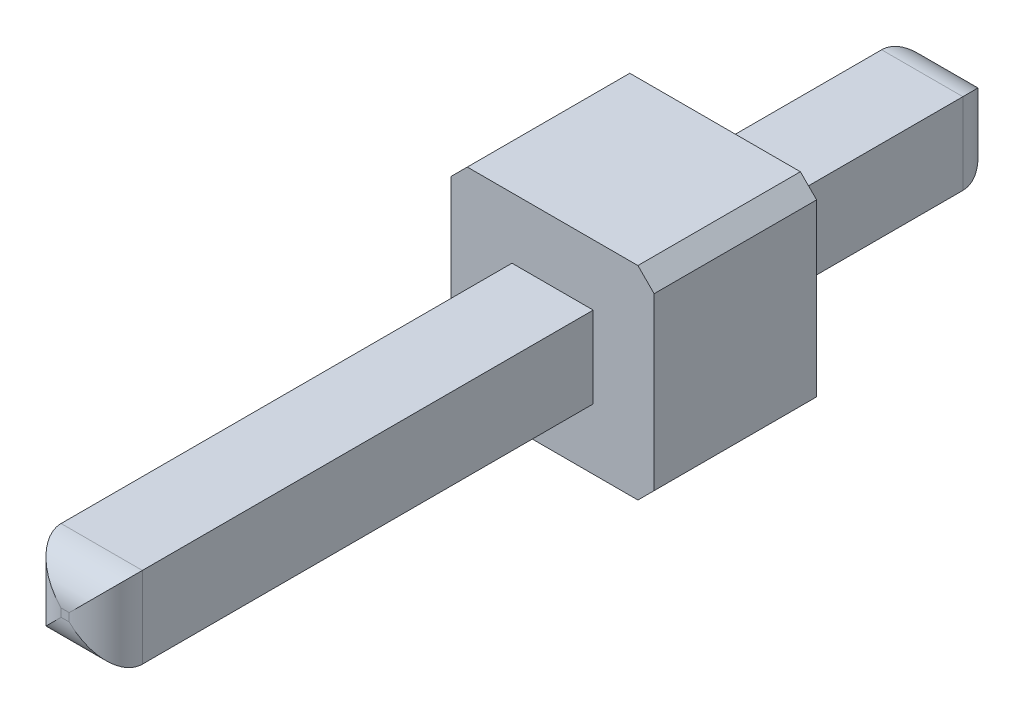
ISO-10303-21;
HEADER;
FILE_DESCRIPTION(('STEP AP214'),'2;1');
FILE_NAME('part.step','',(''),(''),'','','');
FILE_SCHEMA(('AUTOMOTIVE_DESIGN { 1 0 10303 214 1 1 1 1 }'));
ENDSEC;
DATA;
#1=APPLICATION_CONTEXT('core data for automotive mechanical design processes');
#2=APPLICATION_PROTOCOL_DEFINITION('international standard','automotive_design',2000,#1);
#3=PRODUCT_CONTEXT('',#1,'mechanical');
#4=PRODUCT('Part','Part','',(#3));
#5=PRODUCT_RELATED_PRODUCT_CATEGORY('part','',(#4));
#6=PRODUCT_DEFINITION_FORMATION('','',#4);
#7=PRODUCT_DEFINITION_CONTEXT('part definition',#1,'design');
#8=PRODUCT_DEFINITION('design','',#6,#7);
#9=PRODUCT_DEFINITION_SHAPE('','',#8);
#10=(LENGTH_UNIT() NAMED_UNIT(*) SI_UNIT(.MILLI.,.METRE.));
#11=(NAMED_UNIT(*) PLANE_ANGLE_UNIT() SI_UNIT($,.RADIAN.));
#12=(NAMED_UNIT(*) SI_UNIT($,.STERADIAN.) SOLID_ANGLE_UNIT());
#13=UNCERTAINTY_MEASURE_WITH_UNIT(LENGTH_MEASURE(1.E-05),#10,'distance_accuracy_value','');
#14=(GEOMETRIC_REPRESENTATION_CONTEXT(3) GLOBAL_UNCERTAINTY_ASSIGNED_CONTEXT((#13)) GLOBAL_UNIT_ASSIGNED_CONTEXT((#10,
#11,#12)) REPRESENTATION_CONTEXT('',''));
#15=CARTESIAN_POINT('',(0.,0.,0.));
#16=DIRECTION('',(0.,0.,1.));
#17=DIRECTION('',(1.,0.,0.));
#18=AXIS2_PLACEMENT_3D('',#15,#16,#17);
#19=CARTESIAN_POINT('',(-0.5,-0.5,0.));
#20=DIRECTION('',(0.,-1.,0.));
#21=DIRECTION('',(0.,0.,-1.));
#22=AXIS2_PLACEMENT_3D('',#19,#20,#21);
#23=PLANE('',#22);
#24=DIRECTION('',(-1.,0.,0.));
#25=VECTOR('',#24,1.);
#26=CARTESIAN_POINT('',(-0.25,-0.5,0.45));
#27=LINE('',#26,#25);
#28=CARTESIAN_POINT('',(0.5,-0.5,0.45));
#29=VERTEX_POINT('',#28);
#30=CARTESIAN_POINT('',(-0.5,-0.5,0.45));
#31=VERTEX_POINT('',#30);
#32=EDGE_CURVE('P0_E178',#29,#31,#27,.T.);
#33=ORIENTED_EDGE('',*,*,#32,.F.);
#34=DIRECTION('',(0.,0.,1.));
#35=VECTOR('',#34,1.);
#36=CARTESIAN_POINT('',(0.5,-0.5,0.));
#37=LINE('',#36,#35);
#38=CARTESIAN_POINT('',(0.5,-0.5,10.55));
#39=VERTEX_POINT('',#38);
#40=EDGE_CURVE('P0_E153',#29,#39,#37,.T.);
#41=ORIENTED_EDGE('',*,*,#40,.T.);
#42=DIRECTION('',(1.,0.,0.));
#43=VECTOR('',#42,1.);
#44=CARTESIAN_POINT('',(-0.25,-0.5,10.55));
#45=LINE('',#44,#43);
#46=CARTESIAN_POINT('',(-0.5,-0.5,10.55));
#47=VERTEX_POINT('',#46);
#48=EDGE_CURVE('P0_E213',#47,#39,#45,.T.);
#49=ORIENTED_EDGE('',*,*,#48,.F.);
#50=DIRECTION('',(0.,0.,1.));
#51=VECTOR('',#50,1.);
#52=CARTESIAN_POINT('',(-0.5,-0.5,0.));
#53=LINE('',#52,#51);
#54=EDGE_CURVE('P0_E11',#31,#47,#53,.T.);
#55=ORIENTED_EDGE('',*,*,#54,.F.);
#56=EDGE_LOOP('',(#33,#41,#49,#55));
#57=FACE_BOUND('',#56,.T.);
#58=ADVANCED_FACE('P0_F16',(#57),#23,.T.);
#59=CARTESIAN_POINT('',(0.,0.,11.));
#60=DIRECTION('',(0.,0.,1.));
#61=DIRECTION('',(1.,0.,0.));
#62=AXIS2_PLACEMENT_3D('',#59,#60,#61);
#63=PLANE('',#62);
#64=DIRECTION('',(1.,0.,0.));
#65=VECTOR('',#64,1.);
#66=CARTESIAN_POINT('',(0.25,0.05,11.));
#67=LINE('',#66,#65);
#68=CARTESIAN_POINT('',(-0.05,0.05,11.));
#69=VERTEX_POINT('',#68);
#70=CARTESIAN_POINT('',(0.05,0.05,11.));
#71=VERTEX_POINT('',#70);
#72=EDGE_CURVE('P0_E189',#69,#71,#67,.T.);
#73=ORIENTED_EDGE('',*,*,#72,.F.);
#74=DIRECTION('',(0.,1.,0.));
#75=VECTOR('',#74,1.);
#76=CARTESIAN_POINT('',(-0.05,0.25,11.));
#77=LINE('',#76,#75);
#78=CARTESIAN_POINT('',(-0.05,-0.05,11.));
#79=VERTEX_POINT('',#78);
#80=EDGE_CURVE('P0_E25',#79,#69,#77,.T.);
#81=ORIENTED_EDGE('',*,*,#80,.F.);
#82=DIRECTION('',(-1.,0.,0.));
#83=VECTOR('',#82,1.);
#84=CARTESIAN_POINT('',(-0.25,-0.05,11.));
#85=LINE('',#84,#83);
#86=CARTESIAN_POINT('',(0.05,-0.05,11.));
#87=VERTEX_POINT('',#86);
#88=EDGE_CURVE('P0_E73',#87,#79,#85,.T.);
#89=ORIENTED_EDGE('',*,*,#88,.F.);
#90=DIRECTION('',(0.,-1.,0.));
#91=VECTOR('',#90,1.);
#92=CARTESIAN_POINT('',(0.05,-0.25,11.));
#93=LINE('',#92,#91);
#94=EDGE_CURVE('P0_E70',#71,#87,#93,.T.);
#95=ORIENTED_EDGE('',*,*,#94,.F.);
#96=EDGE_LOOP('',(#73,#81,#89,#95));
#97=FACE_BOUND('',#96,.T.);
#98=ADVANCED_FACE('P0_F228',(#97),#63,.T.);
#99=CARTESIAN_POINT('',(-0.5,0.5,0.));
#100=DIRECTION('',(-1.,0.,0.));
#101=DIRECTION('',(0.,0.,1.));
#102=AXIS2_PLACEMENT_3D('',#99,#100,#101);
#103=PLANE('',#102);
#104=DIRECTION('',(0.,1.,0.));
#105=VECTOR('',#104,1.);
#106=CARTESIAN_POINT('',(-0.5,0.25,0.45));
#107=LINE('',#106,#105);
#108=CARTESIAN_POINT('',(-0.5,0.5,0.45));
#109=VERTEX_POINT('',#108);
#110=EDGE_CURVE('P0_E166',#31,#109,#107,.T.);
#111=ORIENTED_EDGE('',*,*,#110,.F.);
#112=ORIENTED_EDGE('',*,*,#54,.T.);
#113=DIRECTION('',(0.,-1.,0.));
#114=VECTOR('',#113,1.);
#115=CARTESIAN_POINT('',(-0.5,0.25,10.55));
#116=LINE('',#115,#114);
#117=CARTESIAN_POINT('',(-0.5,0.5,10.55));
#118=VERTEX_POINT('',#117);
#119=EDGE_CURVE('P0_E150',#118,#47,#116,.T.);
#120=ORIENTED_EDGE('',*,*,#119,.F.);
#121=DIRECTION('',(0.,0.,1.));
#122=VECTOR('',#121,1.);
#123=CARTESIAN_POINT('',(-0.5,0.5,0.));
#124=LINE('',#123,#122);
#125=EDGE_CURVE('P0_E146',#109,#118,#124,.T.);
#126=ORIENTED_EDGE('',*,*,#125,.F.);
#127=EDGE_LOOP('',(#111,#112,#120,#126));
#128=FACE_BOUND('',#127,.T.);
#129=ADVANCED_FACE('P0_F231',(#128),#103,.T.);
#130=CARTESIAN_POINT('',(-0.05,0.25,10.55));
#131=DIRECTION('',(0.,-1.,0.));
#132=DIRECTION('',(-0.707106781186548,0.,0.707106781186547));
#133=AXIS2_PLACEMENT_3D('',#130,#131,#132);
#134=CYLINDRICAL_SURFACE('',#133,0.45);
#135=ORIENTED_EDGE('',*,*,#119,.T.);
#136=CARTESIAN_POINT('',(-0.05,-0.05,10.55));
#137=DIRECTION('',(0.707106781186548,-0.707106781186548,0.));
#138=DIRECTION('',(-0.707106781186548,-0.707106781186548,0.));
#139=AXIS2_PLACEMENT_3D('',#136,#137,#138);
#140=ELLIPSE('',#139,0.636396103067893,0.45);
#141=EDGE_CURVE('P0_E207',#79,#47,#140,.T.);
#142=ORIENTED_EDGE('',*,*,#141,.F.);
#143=ORIENTED_EDGE('',*,*,#80,.T.);
#144=CARTESIAN_POINT('',(-0.05,0.05,10.55));
#145=DIRECTION('',(-0.707106781186548,-0.707106781186548,0.));
#146=DIRECTION('',(-0.707106781186548,0.707106781186548,0.));
#147=AXIS2_PLACEMENT_3D('',#144,#145,#146);
#148=ELLIPSE('',#147,0.636396103067893,0.45);
#149=EDGE_CURVE('P0_E196',#69,#118,#148,.T.);
#150=ORIENTED_EDGE('',*,*,#149,.T.);
#151=EDGE_LOOP('',(#135,#142,#143,#150));
#152=FACE_BOUND('',#151,.T.);
#153=ADVANCED_FACE('P0_F217',(#152),#134,.T.);
#154=CARTESIAN_POINT('',(-0.25,-0.05,10.55));
#155=DIRECTION('',(1.,0.,0.));
#156=DIRECTION('',(0.,-0.707106781186548,0.707106781186547));
#157=AXIS2_PLACEMENT_3D('',#154,#155,#156);
#158=CYLINDRICAL_SURFACE('',#157,0.45);
#159=ORIENTED_EDGE('',*,*,#88,.T.);
#160=ORIENTED_EDGE('',*,*,#141,.T.);
#161=ORIENTED_EDGE('',*,*,#48,.T.);
#162=CARTESIAN_POINT('',(0.05,-0.05,10.55));
#163=DIRECTION('',(0.707106781186548,0.707106781186548,0.));
#164=DIRECTION('',(0.707106781186548,-0.707106781186548,0.));
#165=AXIS2_PLACEMENT_3D('',#162,#163,#164);
#166=ELLIPSE('',#165,0.636396103067893,0.45);
#167=EDGE_CURVE('P0_E201',#87,#39,#166,.T.);
#168=ORIENTED_EDGE('',*,*,#167,.F.);
#169=EDGE_LOOP('',(#159,#160,#161,#168));
#170=FACE_BOUND('',#169,.T.);
#171=ADVANCED_FACE('P0_F224',(#170),#158,.T.);
#172=CARTESIAN_POINT('',(0.05,-0.25,10.55));
#173=DIRECTION('',(0.,1.,0.));
#174=DIRECTION('',(0.707106781186548,0.,0.707106781186547));
#175=AXIS2_PLACEMENT_3D('',#172,#173,#174);
#176=CYLINDRICAL_SURFACE('',#175,0.45);
#177=ORIENTED_EDGE('',*,*,#94,.T.);
#178=ORIENTED_EDGE('',*,*,#167,.T.);
#179=DIRECTION('',(0.,1.,0.));
#180=VECTOR('',#179,1.);
#181=CARTESIAN_POINT('',(0.5,-0.25,10.55));
#182=LINE('',#181,#180);
#183=CARTESIAN_POINT('',(0.5,0.5,10.55));
#184=VERTEX_POINT('',#183);
#185=EDGE_CURVE('P0_E156',#39,#184,#182,.T.);
#186=ORIENTED_EDGE('',*,*,#185,.T.);
#187=CARTESIAN_POINT('',(0.05,0.05,10.55));
#188=DIRECTION('',(-0.707106781186548,0.707106781186548,0.));
#189=DIRECTION('',(0.707106781186548,0.707106781186548,0.));
#190=AXIS2_PLACEMENT_3D('',#187,#188,#189);
#191=ELLIPSE('',#190,0.636396103067893,0.45);
#192=EDGE_CURVE('P0_E192',#71,#184,#191,.T.);
#193=ORIENTED_EDGE('',*,*,#192,.F.);
#194=EDGE_LOOP('',(#177,#178,#186,#193));
#195=FACE_BOUND('',#194,.T.);
#196=ADVANCED_FACE('P0_F223',(#195),#176,.T.);
#197=CARTESIAN_POINT('',(0.25,0.05,10.55));
#198=DIRECTION('',(-1.,0.,0.));
#199=DIRECTION('',(0.,0.707106781186548,0.707106781186547));
#200=AXIS2_PLACEMENT_3D('',#197,#198,#199);
#201=CYLINDRICAL_SURFACE('',#200,0.45);
#202=ORIENTED_EDGE('',*,*,#72,.T.);
#203=ORIENTED_EDGE('',*,*,#192,.T.);
#204=DIRECTION('',(-1.,0.,0.));
#205=VECTOR('',#204,1.);
#206=CARTESIAN_POINT('',(0.25,0.5,10.55));
#207=LINE('',#206,#205);
#208=EDGE_CURVE('P0_E155',#184,#118,#207,.T.);
#209=ORIENTED_EDGE('',*,*,#208,.T.);
#210=ORIENTED_EDGE('',*,*,#149,.F.);
#211=EDGE_LOOP('',(#202,#203,#209,#210));
#212=FACE_BOUND('',#211,.T.);
#213=ADVANCED_FACE('P0_F229',(#212),#201,.T.);
#214=CARTESIAN_POINT('',(0.,0.,0.));
#215=DIRECTION('',(0.,0.,1.));
#216=DIRECTION('',(1.,0.,0.));
#217=AXIS2_PLACEMENT_3D('',#214,#215,#216);
#218=PLANE('',#217);
#219=DIRECTION('',(-1.,0.,0.));
#220=VECTOR('',#219,1.);
#221=CARTESIAN_POINT('',(0.25,0.05,0.));
#222=LINE('',#221,#220);
#223=CARTESIAN_POINT('',(0.05,0.05,0.));
#224=VERTEX_POINT('',#223);
#225=CARTESIAN_POINT('',(-0.05,0.05,0.));
#226=VERTEX_POINT('',#225);
#227=EDGE_CURVE('P0_E127',#224,#226,#222,.T.);
#228=ORIENTED_EDGE('',*,*,#227,.F.);
#229=DIRECTION('',(0.,1.,0.));
#230=VECTOR('',#229,1.);
#231=CARTESIAN_POINT('',(0.05,-0.25,0.));
#232=LINE('',#231,#230);
#233=CARTESIAN_POINT('',(0.05,-0.05,0.));
#234=VERTEX_POINT('',#233);
#235=EDGE_CURVE('P0_E109',#234,#224,#232,.T.);
#236=ORIENTED_EDGE('',*,*,#235,.F.);
#237=DIRECTION('',(1.,0.,0.));
#238=VECTOR('',#237,1.);
#239=CARTESIAN_POINT('',(-0.25,-0.05,0.));
#240=LINE('',#239,#238);
#241=CARTESIAN_POINT('',(-0.05,-0.05,0.));
#242=VERTEX_POINT('',#241);
#243=EDGE_CURVE('P0_E174',#242,#234,#240,.T.);
#244=ORIENTED_EDGE('',*,*,#243,.F.);
#245=DIRECTION('',(0.,-1.,0.));
#246=VECTOR('',#245,1.);
#247=CARTESIAN_POINT('',(-0.05,0.25,0.));
#248=LINE('',#247,#246);
#249=EDGE_CURVE('P0_E132',#226,#242,#248,.T.);
#250=ORIENTED_EDGE('',*,*,#249,.F.);
#251=EDGE_LOOP('',(#228,#236,#244,#250));
#252=FACE_BOUND('',#251,.T.);
#253=ADVANCED_FACE('P0_F134',(#252),#218,.F.);
#254=CARTESIAN_POINT('',(0.5,0.5,0.));
#255=DIRECTION('',(0.,1.,0.));
#256=DIRECTION('',(1.,0.,0.));
#257=AXIS2_PLACEMENT_3D('',#254,#255,#256);
#258=PLANE('',#257);
#259=DIRECTION('',(1.,0.,0.));
#260=VECTOR('',#259,1.);
#261=CARTESIAN_POINT('',(0.25,0.5,0.45));
#262=LINE('',#261,#260);
#263=CARTESIAN_POINT('',(0.5,0.5,0.45));
#264=VERTEX_POINT('',#263);
#265=EDGE_CURVE('P0_E131',#109,#264,#262,.T.);
#266=ORIENTED_EDGE('',*,*,#265,.F.);
#267=ORIENTED_EDGE('',*,*,#125,.T.);
#268=ORIENTED_EDGE('',*,*,#208,.F.);
#269=DIRECTION('',(0.,0.,1.));
#270=VECTOR('',#269,1.);
#271=CARTESIAN_POINT('',(0.5,0.5,0.));
#272=LINE('',#271,#270);
#273=EDGE_CURVE('P0_E125',#264,#184,#272,.T.);
#274=ORIENTED_EDGE('',*,*,#273,.F.);
#275=EDGE_LOOP('',(#266,#267,#268,#274));
#276=FACE_BOUND('',#275,.T.);
#277=ADVANCED_FACE('P0_F250',(#276),#258,.T.);
#278=CARTESIAN_POINT('',(0.5,-0.5,0.));
#279=DIRECTION('',(1.,0.,0.));
#280=DIRECTION('',(0.,1.,0.));
#281=AXIS2_PLACEMENT_3D('',#278,#279,#280);
#282=PLANE('',#281);
#283=DIRECTION('',(0.,-1.,0.));
#284=VECTOR('',#283,1.);
#285=CARTESIAN_POINT('',(0.5,-0.25,0.45));
#286=LINE('',#285,#284);
#287=EDGE_CURVE('P0_E123',#264,#29,#286,.T.);
#288=ORIENTED_EDGE('',*,*,#287,.F.);
#289=ORIENTED_EDGE('',*,*,#273,.T.);
#290=ORIENTED_EDGE('',*,*,#185,.F.);
#291=ORIENTED_EDGE('',*,*,#40,.F.);
#292=EDGE_LOOP('',(#288,#289,#290,#291));
#293=FACE_BOUND('',#292,.T.);
#294=ADVANCED_FACE('P0_F249',(#293),#282,.T.);
#295=CARTESIAN_POINT('',(0.05,-0.25,0.45));
#296=DIRECTION('',(0.,-1.,0.));
#297=DIRECTION('',(0.707106781186548,0.,-0.707106781186548));
#298=AXIS2_PLACEMENT_3D('',#295,#296,#297);
#299=CYLINDRICAL_SURFACE('',#298,0.45);
#300=ORIENTED_EDGE('',*,*,#287,.T.);
#301=CARTESIAN_POINT('',(0.05,-0.05,0.45));
#302=DIRECTION('',(-0.707106781186548,-0.707106781186548,0.));
#303=DIRECTION('',(0.707106781186548,-0.707106781186548,0.));
#304=AXIS2_PLACEMENT_3D('',#301,#302,#303);
#305=ELLIPSE('',#304,0.636396103067893,0.45);
#306=EDGE_CURVE('P0_E117',#234,#29,#305,.T.);
#307=ORIENTED_EDGE('',*,*,#306,.F.);
#308=ORIENTED_EDGE('',*,*,#235,.T.);
#309=CARTESIAN_POINT('',(0.05,0.05,0.45));
#310=DIRECTION('',(-0.707106781186548,0.707106781186548,0.));
#311=DIRECTION('',(-0.707106781186548,-0.707106781186548,0.));
#312=AXIS2_PLACEMENT_3D('',#309,#310,#311);
#313=ELLIPSE('',#312,0.636396103067893,0.45);
#314=EDGE_CURVE('P0_E111',#264,#224,#313,.T.);
#315=ORIENTED_EDGE('',*,*,#314,.F.);
#316=EDGE_LOOP('',(#300,#307,#308,#315));
#317=FACE_BOUND('',#316,.T.);
#318=ADVANCED_FACE('P0_F114',(#317),#299,.T.);
#319=CARTESIAN_POINT('',(-0.25,-0.05,0.45));
#320=DIRECTION('',(-1.,0.,0.));
#321=DIRECTION('',(0.,-0.707106781186548,-0.707106781186548));
#322=AXIS2_PLACEMENT_3D('',#319,#320,#321);
#323=CYLINDRICAL_SURFACE('',#322,0.45);
#324=ORIENTED_EDGE('',*,*,#243,.T.);
#325=ORIENTED_EDGE('',*,*,#306,.T.);
#326=ORIENTED_EDGE('',*,*,#32,.T.);
#327=CARTESIAN_POINT('',(-0.05,-0.05,0.45));
#328=DIRECTION('',(-0.707106781186548,0.707106781186548,0.));
#329=DIRECTION('',(-0.707106781186548,-0.707106781186548,0.));
#330=AXIS2_PLACEMENT_3D('',#327,#328,#329);
#331=ELLIPSE('',#330,0.636396103067893,0.45);
#332=EDGE_CURVE('P0_E165',#242,#31,#331,.T.);
#333=ORIENTED_EDGE('',*,*,#332,.F.);
#334=EDGE_LOOP('',(#324,#325,#326,#333));
#335=FACE_BOUND('',#334,.T.);
#336=ADVANCED_FACE('P0_F260',(#335),#323,.T.);
#337=CARTESIAN_POINT('',(-0.05,0.25,0.45));
#338=DIRECTION('',(0.,1.,0.));
#339=DIRECTION('',(-0.707106781186548,0.,-0.707106781186548));
#340=AXIS2_PLACEMENT_3D('',#337,#338,#339);
#341=CYLINDRICAL_SURFACE('',#340,0.45);
#342=ORIENTED_EDGE('',*,*,#249,.T.);
#343=ORIENTED_EDGE('',*,*,#332,.T.);
#344=ORIENTED_EDGE('',*,*,#110,.T.);
#345=CARTESIAN_POINT('',(-0.05,0.05,0.45));
#346=DIRECTION('',(0.707106781186548,0.707106781186548,0.));
#347=DIRECTION('',(-0.707106781186548,0.707106781186548,0.));
#348=AXIS2_PLACEMENT_3D('',#345,#346,#347);
#349=ELLIPSE('',#348,0.636396103067893,0.45);
#350=EDGE_CURVE('P0_E137',#226,#109,#349,.T.);
#351=ORIENTED_EDGE('',*,*,#350,.F.);
#352=EDGE_LOOP('',(#342,#343,#344,#351));
#353=FACE_BOUND('',#352,.T.);
#354=ADVANCED_FACE('P0_F257',(#353),#341,.T.);
#355=CARTESIAN_POINT('',(0.25,0.05,0.45));
#356=DIRECTION('',(1.,0.,0.));
#357=DIRECTION('',(0.,0.707106781186548,-0.707106781186548));
#358=AXIS2_PLACEMENT_3D('',#355,#356,#357);
#359=CYLINDRICAL_SURFACE('',#358,0.45);
#360=ORIENTED_EDGE('',*,*,#227,.T.);
#361=ORIENTED_EDGE('',*,*,#350,.T.);
#362=ORIENTED_EDGE('',*,*,#265,.T.);
#363=ORIENTED_EDGE('',*,*,#314,.T.);
#364=EDGE_LOOP('',(#360,#361,#362,#363));
#365=FACE_BOUND('',#364,.T.);
#366=ADVANCED_FACE('P0_F126',(#365),#359,.T.);
#367=CLOSED_SHELL('',(#58,#98,#129,#153,#171,#196,#213,#253,#277,#294,#318,#336,#354,#366));
#368=MANIFOLD_SOLID_BREP('P0_B1',#367);
#369=CARTESIAN_POINT('',(0.,0.,3.));
#370=DIRECTION('',(0.,0.,-1.));
#371=DIRECTION('',(0.,-1.,0.));
#372=AXIS2_PLACEMENT_3D('',#369,#370,#371);
#373=PLANE('',#372);
#374=DIRECTION('',(0.,1.,0.));
#375=VECTOR('',#374,1.);
#376=CARTESIAN_POINT('',(-1.25,-1.25,3.));
#377=LINE('',#376,#375);
#378=CARTESIAN_POINT('',(-1.25,-1.04999997653067,3.));
#379=VERTEX_POINT('',#378);
#380=CARTESIAN_POINT('',(-1.25,1.04999997653067,3.));
#381=VERTEX_POINT('',#380);
#382=EDGE_CURVE('P1_E11',#379,#381,#377,.T.);
#383=ORIENTED_EDGE('',*,*,#382,.T.);
#384=DIRECTION('',(0.707106830577382,0.70710673179571,0.));
#385=VECTOR('',#384,1.);
#386=CARTESIAN_POINT('',(-1.25,1.04999997653067,3.));
#387=LINE('',#386,#385);
#388=CARTESIAN_POINT('',(-1.04999997653067,1.24999997206032,3.));
#389=VERTEX_POINT('',#388);
#390=EDGE_CURVE('P1_E175',#381,#389,#387,.T.);
#391=ORIENTED_EDGE('',*,*,#390,.T.);
#392=DIRECTION('',(1.,0.,0.));
#393=VECTOR('',#392,1.);
#394=CARTESIAN_POINT('',(-1.25,1.25,3.));
#395=LINE('',#394,#393);
#396=CARTESIAN_POINT('',(1.04999997653067,1.24999997206032,3.));
#397=VERTEX_POINT('',#396);
#398=EDGE_CURVE('P1_E83',#389,#397,#395,.T.);
#399=ORIENTED_EDGE('',*,*,#398,.T.);
#400=DIRECTION('',(0.707106830577382,-0.70710673179571,0.));
#401=VECTOR('',#400,1.);
#402=CARTESIAN_POINT('',(1.25,1.04999997653067,3.));
#403=LINE('',#402,#401);
#404=CARTESIAN_POINT('',(1.25,1.04999997653067,3.));
#405=VERTEX_POINT('',#404);
#406=EDGE_CURVE('P1_E151',#397,#405,#403,.T.);
#407=ORIENTED_EDGE('',*,*,#406,.T.);
#408=DIRECTION('',(0.,-1.,0.));
#409=VECTOR('',#408,1.);
#410=CARTESIAN_POINT('',(1.25,1.25,3.));
#411=LINE('',#410,#409);
#412=CARTESIAN_POINT('',(1.25,-1.04999997653067,3.));
#413=VERTEX_POINT('',#412);
#414=EDGE_CURVE('P1_E149',#405,#413,#411,.T.);
#415=ORIENTED_EDGE('',*,*,#414,.T.);
#416=DIRECTION('',(-0.707106830577382,-0.70710673179571,0.));
#417=VECTOR('',#416,1.);
#418=CARTESIAN_POINT('',(1.25,-1.04999997653067,3.));
#419=LINE('',#418,#417);
#420=CARTESIAN_POINT('',(1.04999997653067,-1.24999997206032,3.));
#421=VERTEX_POINT('',#420);
#422=EDGE_CURVE('P1_E122',#413,#421,#419,.T.);
#423=ORIENTED_EDGE('',*,*,#422,.T.);
#424=DIRECTION('',(-1.,0.,0.));
#425=VECTOR('',#424,1.);
#426=CARTESIAN_POINT('',(1.25,-1.25,3.));
#427=LINE('',#426,#425);
#428=CARTESIAN_POINT('',(-1.04999997653067,-1.24999997206032,3.));
#429=VERTEX_POINT('',#428);
#430=EDGE_CURVE('P1_E104',#421,#429,#427,.T.);
#431=ORIENTED_EDGE('',*,*,#430,.T.);
#432=DIRECTION('',(-0.707106830577382,0.70710673179571,0.));
#433=VECTOR('',#432,1.);
#434=CARTESIAN_POINT('',(-1.25,-1.04999997653067,3.));
#435=LINE('',#434,#433);
#436=EDGE_CURVE('P1_E144',#429,#379,#435,.T.);
#437=ORIENTED_EDGE('',*,*,#436,.T.);
#438=EDGE_LOOP('',(#383,#391,#399,#407,#415,#423,#431,#437));
#439=FACE_BOUND('',#438,.T.);
#440=ADVANCED_FACE('P1_F16',(#439),#373,.T.);
#441=CARTESIAN_POINT('',(0.,0.,5.));
#442=DIRECTION('',(0.,0.,1.));
#443=DIRECTION('',(1.,0.,0.));
#444=AXIS2_PLACEMENT_3D('',#441,#442,#443);
#445=PLANE('',#444);
#446=DIRECTION('',(0.,1.,0.));
#447=VECTOR('',#446,1.);
#448=CARTESIAN_POINT('',(-1.25,-1.25,5.));
#449=LINE('',#448,#447);
#450=CARTESIAN_POINT('',(-1.25,-1.04999997653067,5.));
#451=VERTEX_POINT('',#450);
#452=CARTESIAN_POINT('',(-1.25,1.04999997653067,5.));
#453=VERTEX_POINT('',#452);
#454=EDGE_CURVE('P1_E27',#451,#453,#449,.T.);
#455=ORIENTED_EDGE('',*,*,#454,.F.);
#456=DIRECTION('',(0.707106830577382,-0.70710673179571,0.));
#457=VECTOR('',#456,1.);
#458=CARTESIAN_POINT('',(-1.25,-1.04999997653067,5.));
#459=LINE('',#458,#457);
#460=CARTESIAN_POINT('',(-1.04999997653067,-1.24999997206032,5.));
#461=VERTEX_POINT('',#460);
#462=EDGE_CURVE('P1_E136',#451,#461,#459,.T.);
#463=ORIENTED_EDGE('',*,*,#462,.T.);
#464=DIRECTION('',(-1.,0.,0.));
#465=VECTOR('',#464,1.);
#466=CARTESIAN_POINT('',(1.25,-1.25,5.));
#467=LINE('',#466,#465);
#468=CARTESIAN_POINT('',(1.04999997653067,-1.24999997206032,5.));
#469=VERTEX_POINT('',#468);
#470=EDGE_CURVE('P1_E127',#469,#461,#467,.T.);
#471=ORIENTED_EDGE('',*,*,#470,.F.);
#472=DIRECTION('',(-0.707106830577382,-0.70710673179571,0.));
#473=VECTOR('',#472,1.);
#474=CARTESIAN_POINT('',(1.25,-1.04999997653067,5.));
#475=LINE('',#474,#473);
#476=CARTESIAN_POINT('',(1.25,-1.04999997653067,5.));
#477=VERTEX_POINT('',#476);
#478=EDGE_CURVE('P1_E114',#477,#469,#475,.T.);
#479=ORIENTED_EDGE('',*,*,#478,.F.);
#480=DIRECTION('',(0.,-1.,0.));
#481=VECTOR('',#480,1.);
#482=CARTESIAN_POINT('',(1.25,1.25,5.));
#483=LINE('',#482,#481);
#484=CARTESIAN_POINT('',(1.25,1.04999997653067,5.));
#485=VERTEX_POINT('',#484);
#486=EDGE_CURVE('P1_E146',#485,#477,#483,.T.);
#487=ORIENTED_EDGE('',*,*,#486,.F.);
#488=DIRECTION('',(-0.707106830577382,0.70710673179571,0.));
#489=VECTOR('',#488,1.);
#490=CARTESIAN_POINT('',(1.25,1.04999997653067,5.));
#491=LINE('',#490,#489);
#492=CARTESIAN_POINT('',(1.04999997653067,1.24999997206032,5.));
#493=VERTEX_POINT('',#492);
#494=EDGE_CURVE('P1_E152',#485,#493,#491,.T.);
#495=ORIENTED_EDGE('',*,*,#494,.T.);
#496=DIRECTION('',(1.,0.,0.));
#497=VECTOR('',#496,1.);
#498=CARTESIAN_POINT('',(-1.25,1.25,5.));
#499=LINE('',#498,#497);
#500=CARTESIAN_POINT('',(-1.04999997653067,1.24999997206032,5.));
#501=VERTEX_POINT('',#500);
#502=EDGE_CURVE('P1_E76',#501,#493,#499,.T.);
#503=ORIENTED_EDGE('',*,*,#502,.F.);
#504=DIRECTION('',(0.707106830577382,0.70710673179571,0.));
#505=VECTOR('',#504,1.);
#506=CARTESIAN_POINT('',(-1.25,1.04999997653067,5.));
#507=LINE('',#506,#505);
#508=EDGE_CURVE('P1_E94',#453,#501,#507,.T.);
#509=ORIENTED_EDGE('',*,*,#508,.F.);
#510=EDGE_LOOP('',(#455,#463,#471,#479,#487,#495,#503,#509));
#511=FACE_BOUND('',#510,.T.);
#512=ADVANCED_FACE('P1_F18',(#511),#445,.T.);
#513=CARTESIAN_POINT('',(-1.25,-1.04999997653067,5.));
#514=DIRECTION('',(-1.,0.,0.));
#515=DIRECTION('',(0.,0.,1.));
#516=AXIS2_PLACEMENT_3D('',#513,#514,#515);
#517=PLANE('',#516);
#518=ORIENTED_EDGE('',*,*,#454,.T.);
#519=DIRECTION('',(0.,0.,-1.));
#520=VECTOR('',#519,1.);
#521=CARTESIAN_POINT('',(-1.25,1.04999997653067,5.));
#522=LINE('',#521,#520);
#523=EDGE_CURVE('P1_E178',#453,#381,#522,.T.);
#524=ORIENTED_EDGE('',*,*,#523,.T.);
#525=ORIENTED_EDGE('',*,*,#382,.F.);
#526=DIRECTION('',(0.,0.,-1.));
#527=VECTOR('',#526,1.);
#528=CARTESIAN_POINT('',(-1.25,-1.04999997653067,5.));
#529=LINE('',#528,#527);
#530=EDGE_CURVE('P1_E187',#451,#379,#529,.T.);
#531=ORIENTED_EDGE('',*,*,#530,.F.);
#532=EDGE_LOOP('',(#518,#524,#525,#531));
#533=FACE_BOUND('',#532,.T.);
#534=ADVANCED_FACE('P1_F182',(#533),#517,.T.);
#535=CARTESIAN_POINT('',(-1.25,1.04999997653067,5.));
#536=DIRECTION('',(-0.70710673179571,0.707106830577382,0.));
#537=DIRECTION('',(0.,0.,1.));
#538=AXIS2_PLACEMENT_3D('',#535,#536,#537);
#539=PLANE('',#538);
#540=ORIENTED_EDGE('',*,*,#508,.T.);
#541=DIRECTION('',(0.,0.,-1.));
#542=VECTOR('',#541,1.);
#543=CARTESIAN_POINT('',(-1.04999997653067,1.24999997206032,5.));
#544=LINE('',#543,#542);
#545=EDGE_CURVE('P1_E168',#501,#389,#544,.T.);
#546=ORIENTED_EDGE('',*,*,#545,.T.);
#547=ORIENTED_EDGE('',*,*,#390,.F.);
#548=ORIENTED_EDGE('',*,*,#523,.F.);
#549=EDGE_LOOP('',(#540,#546,#547,#548));
#550=FACE_BOUND('',#549,.T.);
#551=ADVANCED_FACE('P1_F188',(#550),#539,.T.);
#552=CARTESIAN_POINT('',(-1.04999997653067,1.25,5.));
#553=DIRECTION('',(0.,1.,0.));
#554=DIRECTION('',(1.,0.,0.));
#555=AXIS2_PLACEMENT_3D('',#552,#553,#554);
#556=PLANE('',#555);
#557=ORIENTED_EDGE('',*,*,#502,.T.);
#558=DIRECTION('',(0.,0.,-1.));
#559=VECTOR('',#558,1.);
#560=CARTESIAN_POINT('',(1.04999997653067,1.24999997206032,5.));
#561=LINE('',#560,#559);
#562=EDGE_CURVE('P1_E153',#493,#397,#561,.T.);
#563=ORIENTED_EDGE('',*,*,#562,.T.);
#564=ORIENTED_EDGE('',*,*,#398,.F.);
#565=ORIENTED_EDGE('',*,*,#545,.F.);
#566=EDGE_LOOP('',(#557,#563,#564,#565));
#567=FACE_BOUND('',#566,.T.);
#568=ADVANCED_FACE('P1_F237',(#567),#556,.T.);
#569=CARTESIAN_POINT('',(1.04999997653067,1.24999997206032,5.));
#570=DIRECTION('',(0.70710673179571,0.707106830577382,0.));
#571=DIRECTION('',(0.,0.,-1.));
#572=AXIS2_PLACEMENT_3D('',#569,#570,#571);
#573=PLANE('',#572);
#574=ORIENTED_EDGE('',*,*,#494,.F.);
#575=DIRECTION('',(0.,0.,-1.));
#576=VECTOR('',#575,1.);
#577=CARTESIAN_POINT('',(1.25,1.04999997653067,5.));
#578=LINE('',#577,#576);
#579=EDGE_CURVE('P1_E162',#485,#405,#578,.T.);
#580=ORIENTED_EDGE('',*,*,#579,.T.);
#581=ORIENTED_EDGE('',*,*,#406,.F.);
#582=ORIENTED_EDGE('',*,*,#562,.F.);
#583=EDGE_LOOP('',(#574,#580,#581,#582));
#584=FACE_BOUND('',#583,.T.);
#585=ADVANCED_FACE('P1_F193',(#584),#573,.T.);
#586=CARTESIAN_POINT('',(1.25,1.04999997653067,5.));
#587=DIRECTION('',(1.,0.,0.));
#588=DIRECTION('',(0.,1.,0.));
#589=AXIS2_PLACEMENT_3D('',#586,#587,#588);
#590=PLANE('',#589);
#591=ORIENTED_EDGE('',*,*,#486,.T.);
#592=DIRECTION('',(0.,0.,-1.));
#593=VECTOR('',#592,1.);
#594=CARTESIAN_POINT('',(1.25,-1.04999997653067,5.));
#595=LINE('',#594,#593);
#596=EDGE_CURVE('P1_E118',#477,#413,#595,.T.);
#597=ORIENTED_EDGE('',*,*,#596,.T.);
#598=ORIENTED_EDGE('',*,*,#414,.F.);
#599=ORIENTED_EDGE('',*,*,#579,.F.);
#600=EDGE_LOOP('',(#591,#597,#598,#599));
#601=FACE_BOUND('',#600,.T.);
#602=ADVANCED_FACE('P1_F197',(#601),#590,.T.);
#603=CARTESIAN_POINT('',(1.25,-1.04999997653067,5.));
#604=DIRECTION('',(0.70710673179571,-0.707106830577382,0.));
#605=DIRECTION('',(0.,0.,-1.));
#606=AXIS2_PLACEMENT_3D('',#603,#604,#605);
#607=PLANE('',#606);
#608=ORIENTED_EDGE('',*,*,#478,.T.);
#609=DIRECTION('',(0.,0.,-1.));
#610=VECTOR('',#609,1.);
#611=CARTESIAN_POINT('',(1.04999997653067,-1.24999997206032,5.));
#612=LINE('',#611,#610);
#613=EDGE_CURVE('P1_E117',#469,#421,#612,.T.);
#614=ORIENTED_EDGE('',*,*,#613,.T.);
#615=ORIENTED_EDGE('',*,*,#422,.F.);
#616=ORIENTED_EDGE('',*,*,#596,.F.);
#617=EDGE_LOOP('',(#608,#614,#615,#616));
#618=FACE_BOUND('',#617,.T.);
#619=ADVANCED_FACE('P1_F113',(#618),#607,.T.);
#620=CARTESIAN_POINT('',(1.04999997653067,-1.25,5.));
#621=DIRECTION('',(0.,-1.,0.));
#622=DIRECTION('',(0.,0.,-1.));
#623=AXIS2_PLACEMENT_3D('',#620,#621,#622);
#624=PLANE('',#623);
#625=ORIENTED_EDGE('',*,*,#470,.T.);
#626=DIRECTION('',(0.,0.,-1.));
#627=VECTOR('',#626,1.);
#628=CARTESIAN_POINT('',(-1.04999997653067,-1.24999997206032,5.));
#629=LINE('',#628,#627);
#630=EDGE_CURVE('P1_E138',#461,#429,#629,.T.);
#631=ORIENTED_EDGE('',*,*,#630,.T.);
#632=ORIENTED_EDGE('',*,*,#430,.F.);
#633=ORIENTED_EDGE('',*,*,#613,.F.);
#634=EDGE_LOOP('',(#625,#631,#632,#633));
#635=FACE_BOUND('',#634,.T.);
#636=ADVANCED_FACE('P1_F128',(#635),#624,.T.);
#637=CARTESIAN_POINT('',(-1.04999997653067,-1.24999997206032,5.));
#638=DIRECTION('',(-0.70710673179571,-0.707106830577382,0.));
#639=DIRECTION('',(-0.707106830577382,0.70710673179571,0.));
#640=AXIS2_PLACEMENT_3D('',#637,#638,#639);
#641=PLANE('',#640);
#642=ORIENTED_EDGE('',*,*,#462,.F.);
#643=ORIENTED_EDGE('',*,*,#530,.T.);
#644=ORIENTED_EDGE('',*,*,#436,.F.);
#645=ORIENTED_EDGE('',*,*,#630,.F.);
#646=EDGE_LOOP('',(#642,#643,#644,#645));
#647=FACE_BOUND('',#646,.T.);
#648=ADVANCED_FACE('P1_F216',(#647),#641,.T.);
#649=CLOSED_SHELL('',(#440,#512,#534,#551,#568,#585,#602,#619,#636,#648));
#650=MANIFOLD_SOLID_BREP('P1_B1',#649);
#651=ADVANCED_BREP_SHAPE_REPRESENTATION('',(#18,#368,#650),#14);
#652=SHAPE_DEFINITION_REPRESENTATION(#9,#651);
ENDSEC;
END-ISO-10303-21;
